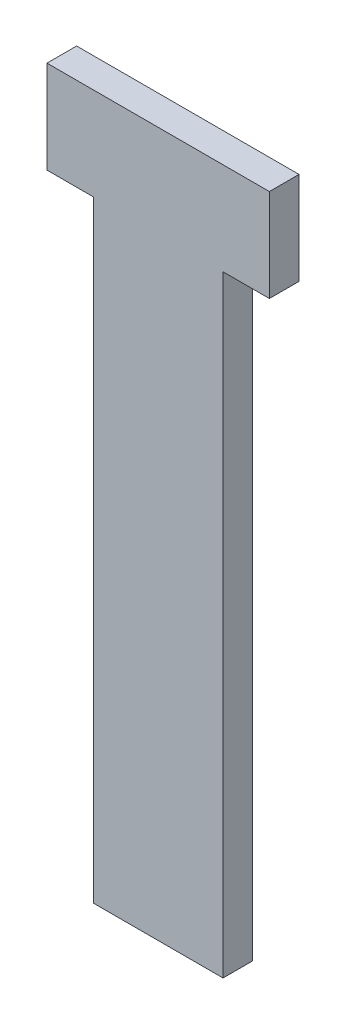
ISO-10303-21;
HEADER;
FILE_DESCRIPTION(('STEP AP214'),'2;1');
FILE_NAME('part.step','',(''),(''),'','','');
FILE_SCHEMA(('AUTOMOTIVE_DESIGN { 1 0 10303 214 1 1 1 1 }'));
ENDSEC;
DATA;
#1=APPLICATION_CONTEXT('core data for automotive mechanical design processes');
#2=APPLICATION_PROTOCOL_DEFINITION('international standard','automotive_design',2000,#1);
#3=PRODUCT_CONTEXT('',#1,'mechanical');
#4=PRODUCT('Part','Part','',(#3));
#5=PRODUCT_RELATED_PRODUCT_CATEGORY('part','',(#4));
#6=PRODUCT_DEFINITION_FORMATION('','',#4);
#7=PRODUCT_DEFINITION_CONTEXT('part definition',#1,'design');
#8=PRODUCT_DEFINITION('design','',#6,#7);
#9=PRODUCT_DEFINITION_SHAPE('','',#8);
#10=(LENGTH_UNIT() NAMED_UNIT(*) SI_UNIT(.MILLI.,.METRE.));
#11=(NAMED_UNIT(*) PLANE_ANGLE_UNIT() SI_UNIT($,.RADIAN.));
#12=(NAMED_UNIT(*) SI_UNIT($,.STERADIAN.) SOLID_ANGLE_UNIT());
#13=UNCERTAINTY_MEASURE_WITH_UNIT(LENGTH_MEASURE(1.E-05),#10,'distance_accuracy_value','');
#14=(GEOMETRIC_REPRESENTATION_CONTEXT(3) GLOBAL_UNCERTAINTY_ASSIGNED_CONTEXT((#13)) GLOBAL_UNIT_ASSIGNED_CONTEXT((#10,
#11,#12)) REPRESENTATION_CONTEXT('',''));
#15=CARTESIAN_POINT('',(0.,0.,0.));
#16=DIRECTION('',(0.,0.,1.));
#17=DIRECTION('',(1.,0.,0.));
#18=AXIS2_PLACEMENT_3D('',#15,#16,#17);
#19=CARTESIAN_POINT('',(-3.5,33.,1.6));
#20=DIRECTION('',(1.,0.,0.));
#21=DIRECTION('',(0.,0.,-1.));
#22=AXIS2_PLACEMENT_3D('',#19,#20,#21);
#23=PLANE('',#22);
#24=DIRECTION('',(0.,-1.,0.));
#25=VECTOR('',#24,1.);
#26=CARTESIAN_POINT('',(-3.5,33.,0.));
#27=LINE('',#26,#25);
#28=CARTESIAN_POINT('',(-3.5,33.,0.));
#29=VERTEX_POINT('',#28);
#30=CARTESIAN_POINT('',(-3.5,0.,0.));
#31=VERTEX_POINT('',#30);
#32=EDGE_CURVE('E139',#29,#31,#27,.T.);
#33=ORIENTED_EDGE('',*,*,#32,.T.);
#34=DIRECTION('',(0.,0.,-1.));
#35=VECTOR('',#34,1.);
#36=CARTESIAN_POINT('',(-3.5,0.,1.6));
#37=LINE('',#36,#35);
#38=CARTESIAN_POINT('',(-3.5,0.,1.6));
#39=VERTEX_POINT('',#38);
#40=EDGE_CURVE('E11',#39,#31,#37,.T.);
#41=ORIENTED_EDGE('',*,*,#40,.F.);
#42=DIRECTION('',(0.,-1.,0.));
#43=VECTOR('',#42,1.);
#44=CARTESIAN_POINT('',(-3.5,33.,1.6));
#45=LINE('',#44,#43);
#46=CARTESIAN_POINT('',(-3.5,33.,1.6));
#47=VERTEX_POINT('',#46);
#48=EDGE_CURVE('E157',#47,#39,#45,.T.);
#49=ORIENTED_EDGE('',*,*,#48,.F.);
#50=DIRECTION('',(0.,0.,-1.));
#51=VECTOR('',#50,1.);
#52=CARTESIAN_POINT('',(-3.5,33.,1.6));
#53=LINE('',#52,#51);
#54=EDGE_CURVE('E135',#47,#29,#53,.T.);
#55=ORIENTED_EDGE('',*,*,#54,.T.);
#56=EDGE_LOOP('',(#33,#41,#49,#55));
#57=FACE_BOUND('',#56,.T.);
#58=ADVANCED_FACE('F37',(#57),#23,.F.);
#59=CARTESIAN_POINT('',(3.5,0.,1.6));
#60=DIRECTION('',(0.,1.,0.));
#61=DIRECTION('',(0.,0.,1.));
#62=AXIS2_PLACEMENT_3D('',#59,#60,#61);
#63=PLANE('',#62);
#64=DIRECTION('',(1.,0.,0.));
#65=VECTOR('',#64,1.);
#66=CARTESIAN_POINT('',(3.5,0.,0.));
#67=LINE('',#66,#65);
#68=CARTESIAN_POINT('',(3.5,0.,0.));
#69=VERTEX_POINT('',#68);
#70=EDGE_CURVE('E143',#31,#69,#67,.T.);
#71=ORIENTED_EDGE('',*,*,#70,.T.);
#72=DIRECTION('',(0.,0.,-1.));
#73=VECTOR('',#72,1.);
#74=CARTESIAN_POINT('',(3.5,0.,1.6));
#75=LINE('',#74,#73);
#76=CARTESIAN_POINT('',(3.5,0.,1.6));
#77=VERTEX_POINT('',#76);
#78=EDGE_CURVE('E45',#77,#69,#75,.T.);
#79=ORIENTED_EDGE('',*,*,#78,.F.);
#80=DIRECTION('',(1.,0.,0.));
#81=VECTOR('',#80,1.);
#82=CARTESIAN_POINT('',(3.5,0.,1.6));
#83=LINE('',#82,#81);
#84=EDGE_CURVE('E99',#39,#77,#83,.T.);
#85=ORIENTED_EDGE('',*,*,#84,.F.);
#86=ORIENTED_EDGE('',*,*,#40,.T.);
#87=EDGE_LOOP('',(#71,#79,#85,#86));
#88=FACE_BOUND('',#87,.T.);
#89=ADVANCED_FACE('F199',(#88),#63,.F.);
#90=CARTESIAN_POINT('',(3.5,33.,1.6));
#91=DIRECTION('',(-1.,0.,0.));
#92=DIRECTION('',(0.,0.,1.));
#93=AXIS2_PLACEMENT_3D('',#90,#91,#92);
#94=PLANE('',#93);
#95=DIRECTION('',(0.,1.,0.));
#96=VECTOR('',#95,1.);
#97=CARTESIAN_POINT('',(3.5,33.,0.));
#98=LINE('',#97,#96);
#99=CARTESIAN_POINT('',(3.5,33.,0.));
#100=VERTEX_POINT('',#99);
#101=EDGE_CURVE('E145',#69,#100,#98,.T.);
#102=ORIENTED_EDGE('',*,*,#101,.T.);
#103=DIRECTION('',(0.,0.,-1.));
#104=VECTOR('',#103,1.);
#105=CARTESIAN_POINT('',(3.5,33.,1.6));
#106=LINE('',#105,#104);
#107=CARTESIAN_POINT('',(3.5,33.,1.6));
#108=VERTEX_POINT('',#107);
#109=EDGE_CURVE('E166',#108,#100,#106,.T.);
#110=ORIENTED_EDGE('',*,*,#109,.F.);
#111=DIRECTION('',(0.,1.,0.));
#112=VECTOR('',#111,1.);
#113=CARTESIAN_POINT('',(3.5,33.,1.6));
#114=LINE('',#113,#112);
#115=EDGE_CURVE('E175',#77,#108,#114,.T.);
#116=ORIENTED_EDGE('',*,*,#115,.F.);
#117=ORIENTED_EDGE('',*,*,#78,.T.);
#118=EDGE_LOOP('',(#102,#110,#116,#117));
#119=FACE_BOUND('',#118,.T.);
#120=ADVANCED_FACE('F173',(#119),#94,.F.);
#121=CARTESIAN_POINT('',(6.,33.,1.6));
#122=DIRECTION('',(0.,1.,0.));
#123=DIRECTION('',(0.,0.,1.));
#124=AXIS2_PLACEMENT_3D('',#121,#122,#123);
#125=PLANE('',#124);
#126=DIRECTION('',(1.,0.,0.));
#127=VECTOR('',#126,1.);
#128=CARTESIAN_POINT('',(6.,33.,0.));
#129=LINE('',#128,#127);
#130=CARTESIAN_POINT('',(6.,33.,0.));
#131=VERTEX_POINT('',#130);
#132=EDGE_CURVE('E148',#100,#131,#129,.T.);
#133=ORIENTED_EDGE('',*,*,#132,.T.);
#134=DIRECTION('',(0.,0.,-1.));
#135=VECTOR('',#134,1.);
#136=CARTESIAN_POINT('',(6.,33.,1.6));
#137=LINE('',#136,#135);
#138=CARTESIAN_POINT('',(6.,33.,1.6));
#139=VERTEX_POINT('',#138);
#140=EDGE_CURVE('E162',#139,#131,#137,.T.);
#141=ORIENTED_EDGE('',*,*,#140,.F.);
#142=DIRECTION('',(1.,0.,0.));
#143=VECTOR('',#142,1.);
#144=CARTESIAN_POINT('',(6.,33.,1.6));
#145=LINE('',#144,#143);
#146=EDGE_CURVE('E188',#108,#139,#145,.T.);
#147=ORIENTED_EDGE('',*,*,#146,.F.);
#148=ORIENTED_EDGE('',*,*,#109,.T.);
#149=EDGE_LOOP('',(#133,#141,#147,#148));
#150=FACE_BOUND('',#149,.T.);
#151=ADVANCED_FACE('F183',(#150),#125,.F.);
#152=CARTESIAN_POINT('',(6.,38.,1.6));
#153=DIRECTION('',(-1.,0.,0.));
#154=DIRECTION('',(0.,-1.,0.));
#155=AXIS2_PLACEMENT_3D('',#152,#153,#154);
#156=PLANE('',#155);
#157=DIRECTION('',(0.,1.,0.));
#158=VECTOR('',#157,1.);
#159=CARTESIAN_POINT('',(6.,38.,0.));
#160=LINE('',#159,#158);
#161=CARTESIAN_POINT('',(6.,38.,0.));
#162=VERTEX_POINT('',#161);
#163=EDGE_CURVE('E151',#131,#162,#160,.T.);
#164=ORIENTED_EDGE('',*,*,#163,.T.);
#165=DIRECTION('',(0.,0.,-1.));
#166=VECTOR('',#165,1.);
#167=CARTESIAN_POINT('',(6.,38.,1.6));
#168=LINE('',#167,#166);
#169=CARTESIAN_POINT('',(6.,38.,1.6));
#170=VERTEX_POINT('',#169);
#171=EDGE_CURVE('E129',#170,#162,#168,.T.);
#172=ORIENTED_EDGE('',*,*,#171,.F.);
#173=DIRECTION('',(0.,1.,0.));
#174=VECTOR('',#173,1.);
#175=CARTESIAN_POINT('',(6.,38.,1.6));
#176=LINE('',#175,#174);
#177=EDGE_CURVE('E120',#139,#170,#176,.T.);
#178=ORIENTED_EDGE('',*,*,#177,.F.);
#179=ORIENTED_EDGE('',*,*,#140,.T.);
#180=EDGE_LOOP('',(#164,#172,#178,#179));
#181=FACE_BOUND('',#180,.T.);
#182=ADVANCED_FACE('F186',(#181),#156,.F.);
#183=CARTESIAN_POINT('',(6.,38.,1.6));
#184=DIRECTION('',(0.,-1.,0.));
#185=DIRECTION('',(0.,0.,-1.));
#186=AXIS2_PLACEMENT_3D('',#183,#184,#185);
#187=PLANE('',#186);
#188=DIRECTION('',(-1.,0.,0.));
#189=VECTOR('',#188,1.);
#190=CARTESIAN_POINT('',(6.,38.,0.));
#191=LINE('',#190,#189);
#192=CARTESIAN_POINT('',(-6.,38.,0.));
#193=VERTEX_POINT('',#192);
#194=EDGE_CURVE('E128',#162,#193,#191,.T.);
#195=ORIENTED_EDGE('',*,*,#194,.T.);
#196=DIRECTION('',(0.,0.,-1.));
#197=VECTOR('',#196,1.);
#198=CARTESIAN_POINT('',(-6.,38.,1.6));
#199=LINE('',#198,#197);
#200=CARTESIAN_POINT('',(-6.,38.,1.6));
#201=VERTEX_POINT('',#200);
#202=EDGE_CURVE('E125',#201,#193,#199,.T.);
#203=ORIENTED_EDGE('',*,*,#202,.F.);
#204=DIRECTION('',(-1.,0.,0.));
#205=VECTOR('',#204,1.);
#206=CARTESIAN_POINT('',(6.,38.,1.6));
#207=LINE('',#206,#205);
#208=EDGE_CURVE('E114',#170,#201,#207,.T.);
#209=ORIENTED_EDGE('',*,*,#208,.F.);
#210=ORIENTED_EDGE('',*,*,#171,.T.);
#211=EDGE_LOOP('',(#195,#203,#209,#210));
#212=FACE_BOUND('',#211,.T.);
#213=ADVANCED_FACE('F126',(#212),#187,.F.);
#214=CARTESIAN_POINT('',(-6.,33.,1.6));
#215=DIRECTION('',(1.,0.,0.));
#216=DIRECTION('',(0.,1.,0.));
#217=AXIS2_PLACEMENT_3D('',#214,#215,#216);
#218=PLANE('',#217);
#219=DIRECTION('',(0.,-1.,0.));
#220=VECTOR('',#219,1.);
#221=CARTESIAN_POINT('',(-6.,33.,0.));
#222=LINE('',#221,#220);
#223=CARTESIAN_POINT('',(-6.,33.,0.));
#224=VERTEX_POINT('',#223);
#225=EDGE_CURVE('E85',#193,#224,#222,.T.);
#226=ORIENTED_EDGE('',*,*,#225,.T.);
#227=DIRECTION('',(0.,0.,-1.));
#228=VECTOR('',#227,1.);
#229=CARTESIAN_POINT('',(-6.,33.,1.6));
#230=LINE('',#229,#228);
#231=CARTESIAN_POINT('',(-6.,33.,1.6));
#232=VERTEX_POINT('',#231);
#233=EDGE_CURVE('E130',#232,#224,#230,.T.);
#234=ORIENTED_EDGE('',*,*,#233,.F.);
#235=DIRECTION('',(0.,-1.,0.));
#236=VECTOR('',#235,1.);
#237=CARTESIAN_POINT('',(-6.,33.,1.6));
#238=LINE('',#237,#236);
#239=EDGE_CURVE('E118',#201,#232,#238,.T.);
#240=ORIENTED_EDGE('',*,*,#239,.F.);
#241=ORIENTED_EDGE('',*,*,#202,.T.);
#242=EDGE_LOOP('',(#226,#234,#240,#241));
#243=FACE_BOUND('',#242,.T.);
#244=ADVANCED_FACE('F132',(#243),#218,.F.);
#245=CARTESIAN_POINT('',(-3.5,33.,1.6));
#246=DIRECTION('',(0.,1.,0.));
#247=DIRECTION('',(0.,0.,1.));
#248=AXIS2_PLACEMENT_3D('',#245,#246,#247);
#249=PLANE('',#248);
#250=DIRECTION('',(1.,0.,0.));
#251=VECTOR('',#250,1.);
#252=CARTESIAN_POINT('',(-3.5,33.,0.));
#253=LINE('',#252,#251);
#254=EDGE_CURVE('E91',#224,#29,#253,.T.);
#255=ORIENTED_EDGE('',*,*,#254,.T.);
#256=ORIENTED_EDGE('',*,*,#54,.F.);
#257=DIRECTION('',(1.,0.,0.));
#258=VECTOR('',#257,1.);
#259=CARTESIAN_POINT('',(-3.5,33.,1.6));
#260=LINE('',#259,#258);
#261=EDGE_CURVE('E55',#232,#47,#260,.T.);
#262=ORIENTED_EDGE('',*,*,#261,.F.);
#263=ORIENTED_EDGE('',*,*,#233,.T.);
#264=EDGE_LOOP('',(#255,#256,#262,#263));
#265=FACE_BOUND('',#264,.T.);
#266=ADVANCED_FACE('F215',(#265),#249,.F.);
#267=CARTESIAN_POINT('',(0.,0.,1.6));
#268=DIRECTION('',(0.,0.,-1.));
#269=DIRECTION('',(-1.,0.,0.));
#270=AXIS2_PLACEMENT_3D('',#267,#268,#269);
#271=PLANE('',#270);
#272=ORIENTED_EDGE('',*,*,#48,.T.);
#273=ORIENTED_EDGE('',*,*,#84,.T.);
#274=ORIENTED_EDGE('',*,*,#115,.T.);
#275=ORIENTED_EDGE('',*,*,#146,.T.);
#276=ORIENTED_EDGE('',*,*,#177,.T.);
#277=ORIENTED_EDGE('',*,*,#208,.T.);
#278=ORIENTED_EDGE('',*,*,#239,.T.);
#279=ORIENTED_EDGE('',*,*,#261,.T.);
#280=EDGE_LOOP('',(#272,#273,#274,#275,#276,#277,#278,#279));
#281=FACE_BOUND('',#280,.T.);
#282=ADVANCED_FACE('F116',(#281),#271,.F.);
#283=CARTESIAN_POINT('',(0.,0.,0.));
#284=DIRECTION('',(0.,0.,-1.));
#285=DIRECTION('',(-1.,0.,0.));
#286=AXIS2_PLACEMENT_3D('',#283,#284,#285);
#287=PLANE('',#286);
#288=ORIENTED_EDGE('',*,*,#32,.F.);
#289=ORIENTED_EDGE('',*,*,#254,.F.);
#290=ORIENTED_EDGE('',*,*,#225,.F.);
#291=ORIENTED_EDGE('',*,*,#194,.F.);
#292=ORIENTED_EDGE('',*,*,#163,.F.);
#293=ORIENTED_EDGE('',*,*,#132,.F.);
#294=ORIENTED_EDGE('',*,*,#101,.F.);
#295=ORIENTED_EDGE('',*,*,#70,.F.);
#296=EDGE_LOOP('',(#288,#289,#290,#291,#292,#293,#294,#295));
#297=FACE_BOUND('',#296,.T.);
#298=ADVANCED_FACE('F179',(#297),#287,.T.);
#299=CLOSED_SHELL('',(#58,#89,#120,#151,#182,#213,#244,#266,#282,#298));
#300=MANIFOLD_SOLID_BREP('B2',#299);
#301=ADVANCED_BREP_SHAPE_REPRESENTATION('',(#18,#300),#14);
#302=SHAPE_DEFINITION_REPRESENTATION(#9,#301);
ENDSEC;
END-ISO-10303-21;
